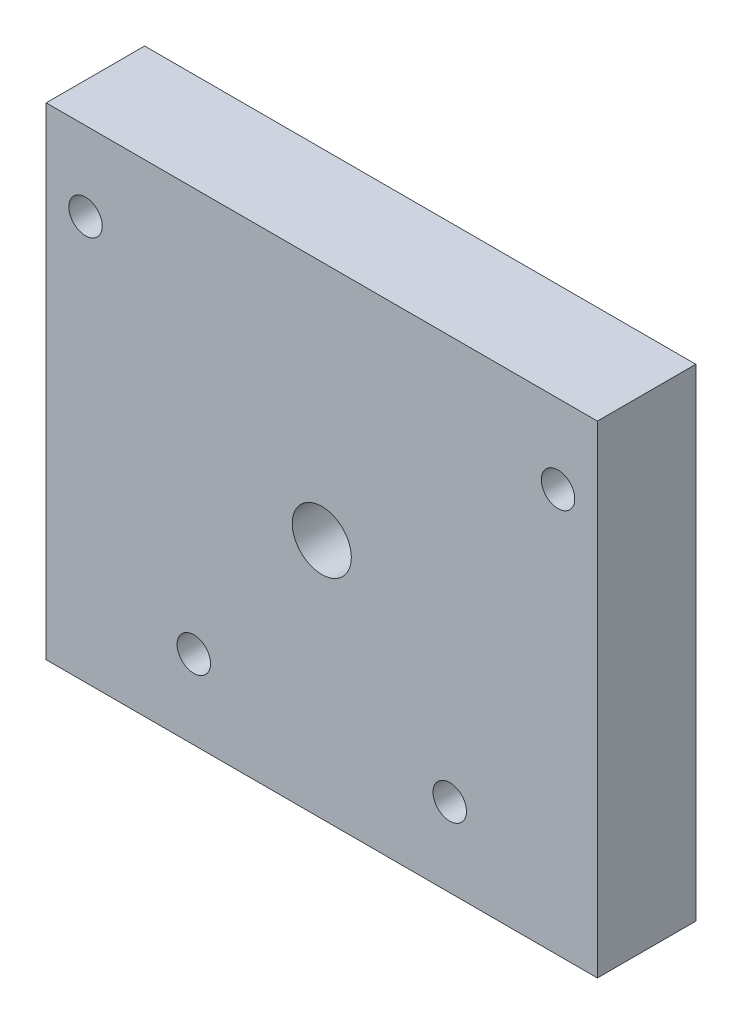
ISO-10303-21;
HEADER;
FILE_DESCRIPTION(('STEP AP214'),'2;1');
FILE_NAME('part.step','',(''),(''),'','','');
FILE_SCHEMA(('AUTOMOTIVE_DESIGN { 1 0 10303 214 1 1 1 1 }'));
ENDSEC;
DATA;
#1=APPLICATION_CONTEXT('core data for automotive mechanical design processes');
#2=APPLICATION_PROTOCOL_DEFINITION('international standard','automotive_design',2000,#1);
#3=PRODUCT_CONTEXT('',#1,'mechanical');
#4=PRODUCT('Part','Part','',(#3));
#5=PRODUCT_RELATED_PRODUCT_CATEGORY('part','',(#4));
#6=PRODUCT_DEFINITION_FORMATION('','',#4);
#7=PRODUCT_DEFINITION_CONTEXT('part definition',#1,'design');
#8=PRODUCT_DEFINITION('design','',#6,#7);
#9=PRODUCT_DEFINITION_SHAPE('','',#8);
#10=(LENGTH_UNIT() NAMED_UNIT(*) SI_UNIT(.MILLI.,.METRE.));
#11=(NAMED_UNIT(*) PLANE_ANGLE_UNIT() SI_UNIT($,.RADIAN.));
#12=(NAMED_UNIT(*) SI_UNIT($,.STERADIAN.) SOLID_ANGLE_UNIT());
#13=UNCERTAINTY_MEASURE_WITH_UNIT(LENGTH_MEASURE(1.E-05),#10,'distance_accuracy_value','');
#14=(GEOMETRIC_REPRESENTATION_CONTEXT(3) GLOBAL_UNCERTAINTY_ASSIGNED_CONTEXT((#13)) GLOBAL_UNIT_ASSIGNED_CONTEXT((#10,
#11,#12)) REPRESENTATION_CONTEXT('',''));
#15=CARTESIAN_POINT('',(0.,0.,0.));
#16=DIRECTION('',(0.,0.,1.));
#17=DIRECTION('',(1.,0.,0.));
#18=AXIS2_PLACEMENT_3D('',#15,#16,#17);
#19=CARTESIAN_POINT('',(-120.,82.5,50.));
#20=DIRECTION('',(0.,0.,-1.));
#21=DIRECTION('',(-1.,0.,0.));
#22=AXIS2_PLACEMENT_3D('',#19,#20,#21);
#23=CYLINDRICAL_SURFACE('',#22,5.24999999999999);
#24=CARTESIAN_POINT('',(-120.,82.5,0.));
#25=DIRECTION('',(0.,0.,1.));
#26=DIRECTION('',(1.,0.,0.));
#27=AXIS2_PLACEMENT_3D('',#24,#25,#26);
#28=CIRCLE('',#27,5.24999999999999);
#29=CARTESIAN_POINT('',(-114.75,82.5,0.));
#30=VERTEX_POINT('',#29);
#31=EDGE_CURVE('E138',#30,#30,#28,.T.);
#32=ORIENTED_EDGE('',*,*,#31,.F.);
#33=EDGE_LOOP('',(#32));
#34=FACE_BOUND('',#33,.T.);
#35=CARTESIAN_POINT('',(-120.,82.5,38.));
#36=DIRECTION('',(0.,0.,1.));
#37=DIRECTION('',(1.,0.,0.));
#38=AXIS2_PLACEMENT_3D('',#35,#36,#37);
#39=CIRCLE('',#38,5.24999999999999);
#40=CARTESIAN_POINT('',(-114.75,82.5,38.));
#41=VERTEX_POINT('',#40);
#42=EDGE_CURVE('E37',#41,#41,#39,.T.);
#43=ORIENTED_EDGE('',*,*,#42,.T.);
#44=EDGE_LOOP('',(#43));
#45=FACE_BOUND('',#44,.T.);
#46=ADVANCED_FACE('F33',(#34,#45),#23,.F.);
#47=CARTESIAN_POINT('',(120.,82.5,50.));
#48=DIRECTION('',(0.,0.,-1.));
#49=DIRECTION('',(-1.,0.,0.));
#50=AXIS2_PLACEMENT_3D('',#47,#48,#49);
#51=CYLINDRICAL_SURFACE('',#50,5.24999999999999);
#52=CARTESIAN_POINT('',(120.,82.5,0.));
#53=DIRECTION('',(0.,0.,1.));
#54=DIRECTION('',(1.,0.,0.));
#55=AXIS2_PLACEMENT_3D('',#52,#53,#54);
#56=CIRCLE('',#55,5.24999999999999);
#57=CARTESIAN_POINT('',(125.25,82.5,0.));
#58=VERTEX_POINT('',#57);
#59=EDGE_CURVE('E130',#58,#58,#56,.T.);
#60=ORIENTED_EDGE('',*,*,#59,.F.);
#61=EDGE_LOOP('',(#60));
#62=FACE_BOUND('',#61,.T.);
#63=CARTESIAN_POINT('',(120.,82.5,38.));
#64=DIRECTION('',(0.,0.,1.));
#65=DIRECTION('',(1.,0.,0.));
#66=AXIS2_PLACEMENT_3D('',#63,#64,#65);
#67=CIRCLE('',#66,5.24999999999999);
#68=CARTESIAN_POINT('',(125.25,82.5,38.));
#69=VERTEX_POINT('',#68);
#70=EDGE_CURVE('E116',#69,#69,#67,.T.);
#71=ORIENTED_EDGE('',*,*,#70,.T.);
#72=EDGE_LOOP('',(#71));
#73=FACE_BOUND('',#72,.T.);
#74=ADVANCED_FACE('F167',(#62,#73),#51,.F.);
#75=CARTESIAN_POINT('',(-65.,-82.5,50.));
#76=DIRECTION('',(0.,0.,-1.));
#77=DIRECTION('',(-1.,0.,0.));
#78=AXIS2_PLACEMENT_3D('',#75,#76,#77);
#79=CYLINDRICAL_SURFACE('',#78,5.25);
#80=CARTESIAN_POINT('',(-65.,-82.5,0.));
#81=DIRECTION('',(0.,0.,1.));
#82=DIRECTION('',(1.,0.,0.));
#83=AXIS2_PLACEMENT_3D('',#80,#81,#82);
#84=CIRCLE('',#83,5.25);
#85=CARTESIAN_POINT('',(-59.75,-82.5,0.));
#86=VERTEX_POINT('',#85);
#87=EDGE_CURVE('E125',#86,#86,#84,.T.);
#88=ORIENTED_EDGE('',*,*,#87,.F.);
#89=EDGE_LOOP('',(#88));
#90=FACE_BOUND('',#89,.T.);
#91=CARTESIAN_POINT('',(-65.,-82.5,38.));
#92=DIRECTION('',(0.,0.,1.));
#93=DIRECTION('',(1.,0.,0.));
#94=AXIS2_PLACEMENT_3D('',#91,#92,#93);
#95=CIRCLE('',#94,5.25);
#96=CARTESIAN_POINT('',(-59.75,-82.5,38.));
#97=VERTEX_POINT('',#96);
#98=EDGE_CURVE('E113',#97,#97,#95,.T.);
#99=ORIENTED_EDGE('',*,*,#98,.T.);
#100=EDGE_LOOP('',(#99));
#101=FACE_BOUND('',#100,.T.);
#102=ADVANCED_FACE('F172',(#90,#101),#79,.F.);
#103=CARTESIAN_POINT('',(65.,-82.5,50.));
#104=DIRECTION('',(0.,0.,-1.));
#105=DIRECTION('',(-1.,0.,0.));
#106=AXIS2_PLACEMENT_3D('',#103,#104,#105);
#107=CYLINDRICAL_SURFACE('',#106,5.25);
#108=CARTESIAN_POINT('',(65.,-82.5,0.));
#109=DIRECTION('',(0.,0.,1.));
#110=DIRECTION('',(1.,0.,0.));
#111=AXIS2_PLACEMENT_3D('',#108,#109,#110);
#112=CIRCLE('',#111,5.25);
#113=CARTESIAN_POINT('',(70.25,-82.5,0.));
#114=VERTEX_POINT('',#113);
#115=EDGE_CURVE('E121',#114,#114,#112,.T.);
#116=ORIENTED_EDGE('',*,*,#115,.F.);
#117=EDGE_LOOP('',(#116));
#118=FACE_BOUND('',#117,.T.);
#119=CARTESIAN_POINT('',(65.,-82.5,38.));
#120=DIRECTION('',(0.,0.,1.));
#121=DIRECTION('',(1.,0.,0.));
#122=AXIS2_PLACEMENT_3D('',#119,#120,#121);
#123=CIRCLE('',#122,5.25);
#124=CARTESIAN_POINT('',(70.25,-82.5,38.));
#125=VERTEX_POINT('',#124);
#126=EDGE_CURVE('E110',#125,#125,#123,.T.);
#127=ORIENTED_EDGE('',*,*,#126,.T.);
#128=EDGE_LOOP('',(#127));
#129=FACE_BOUND('',#128,.T.);
#130=ADVANCED_FACE('F179',(#118,#129),#107,.F.);
#131=CARTESIAN_POINT('',(0.,0.,50.));
#132=DIRECTION('',(0.,0.,-1.));
#133=DIRECTION('',(-1.,0.,0.));
#134=AXIS2_PLACEMENT_3D('',#131,#132,#133);
#135=PLANE('',#134);
#136=CARTESIAN_POINT('',(-120.,82.5,50.));
#137=DIRECTION('',(0.,0.,1.));
#138=DIRECTION('',(1.,0.,0.));
#139=AXIS2_PLACEMENT_3D('',#136,#137,#138);
#140=CIRCLE('',#139,8.49999999999999);
#141=CARTESIAN_POINT('',(-111.5,82.5,50.));
#142=VERTEX_POINT('',#141);
#143=EDGE_CURVE('E215',#142,#142,#140,.T.);
#144=ORIENTED_EDGE('',*,*,#143,.F.);
#145=EDGE_LOOP('',(#144));
#146=FACE_BOUND('',#145,.T.);
#147=CARTESIAN_POINT('',(120.,82.5,50.));
#148=DIRECTION('',(0.,0.,1.));
#149=DIRECTION('',(1.,0.,0.));
#150=AXIS2_PLACEMENT_3D('',#147,#148,#149);
#151=CIRCLE('',#150,8.49999999999999);
#152=CARTESIAN_POINT('',(128.5,82.5,50.));
#153=VERTEX_POINT('',#152);
#154=EDGE_CURVE('E223',#153,#153,#151,.T.);
#155=ORIENTED_EDGE('',*,*,#154,.F.);
#156=EDGE_LOOP('',(#155));
#157=FACE_BOUND('',#156,.T.);
#158=CARTESIAN_POINT('',(65.,-82.5,50.));
#159=DIRECTION('',(0.,0.,1.));
#160=DIRECTION('',(1.,0.,0.));
#161=AXIS2_PLACEMENT_3D('',#158,#159,#160);
#162=CIRCLE('',#161,8.5);
#163=CARTESIAN_POINT('',(73.5,-82.5,50.));
#164=VERTEX_POINT('',#163);
#165=EDGE_CURVE('E229',#164,#164,#162,.T.);
#166=ORIENTED_EDGE('',*,*,#165,.F.);
#167=EDGE_LOOP('',(#166));
#168=FACE_BOUND('',#167,.T.);
#169=CARTESIAN_POINT('',(-65.,-82.5,50.));
#170=DIRECTION('',(0.,0.,1.));
#171=DIRECTION('',(1.,0.,0.));
#172=AXIS2_PLACEMENT_3D('',#169,#170,#171);
#173=CIRCLE('',#172,8.5);
#174=CARTESIAN_POINT('',(-56.5,-82.5,50.));
#175=VERTEX_POINT('',#174);
#176=EDGE_CURVE('E133',#175,#175,#173,.T.);
#177=ORIENTED_EDGE('',*,*,#176,.F.);
#178=EDGE_LOOP('',(#177));
#179=FACE_BOUND('',#178,.T.);
#180=DIRECTION('',(0.,1.,0.));
#181=VECTOR('',#180,1.);
#182=CARTESIAN_POINT('',(140.,-122.5,50.));
#183=LINE('',#182,#181);
#184=CARTESIAN_POINT('',(140.,-122.5,50.));
#185=VERTEX_POINT('',#184);
#186=CARTESIAN_POINT('',(140.,122.5,50.));
#187=VERTEX_POINT('',#186);
#188=EDGE_CURVE('E88',#185,#187,#183,.T.);
#189=ORIENTED_EDGE('',*,*,#188,.T.);
#190=DIRECTION('',(-1.,0.,0.));
#191=VECTOR('',#190,1.);
#192=CARTESIAN_POINT('',(-140.,122.5,50.));
#193=LINE('',#192,#191);
#194=CARTESIAN_POINT('',(-140.,122.5,50.));
#195=VERTEX_POINT('',#194);
#196=EDGE_CURVE('E82',#187,#195,#193,.T.);
#197=ORIENTED_EDGE('',*,*,#196,.T.);
#198=DIRECTION('',(0.,-1.,0.));
#199=VECTOR('',#198,1.);
#200=CARTESIAN_POINT('',(-140.,-122.5,50.));
#201=LINE('',#200,#199);
#202=CARTESIAN_POINT('',(-140.,-122.5,50.));
#203=VERTEX_POINT('',#202);
#204=EDGE_CURVE('E86',#195,#203,#201,.T.);
#205=ORIENTED_EDGE('',*,*,#204,.T.);
#206=DIRECTION('',(1.,0.,0.));
#207=VECTOR('',#206,1.);
#208=CARTESIAN_POINT('',(-140.,-122.5,50.));
#209=LINE('',#208,#207);
#210=EDGE_CURVE('E52',#203,#185,#209,.T.);
#211=ORIENTED_EDGE('',*,*,#210,.T.);
#212=EDGE_LOOP('',(#189,#197,#205,#211));
#213=FACE_BOUND('',#212,.T.);
#214=CARTESIAN_POINT('',(0.,0.,50.));
#215=DIRECTION('',(0.,0.,1.));
#216=DIRECTION('',(1.,0.,0.));
#217=AXIS2_PLACEMENT_3D('',#214,#215,#216);
#218=CIRCLE('',#217,15.);
#219=CARTESIAN_POINT('',(15.,0.,50.));
#220=VERTEX_POINT('',#219);
#221=EDGE_CURVE('E104',#220,#220,#218,.T.);
#222=ORIENTED_EDGE('',*,*,#221,.F.);
#223=EDGE_LOOP('',(#222));
#224=FACE_BOUND('',#223,.T.);
#225=ADVANCED_FACE('F83',(#146,#157,#168,#179,#213,#224),#135,.F.);
#226=CARTESIAN_POINT('',(0.,0.,0.));
#227=DIRECTION('',(0.,0.,-1.));
#228=DIRECTION('',(-1.,0.,0.));
#229=AXIS2_PLACEMENT_3D('',#226,#227,#228);
#230=PLANE('',#229);
#231=ORIENTED_EDGE('',*,*,#87,.T.);
#232=EDGE_LOOP('',(#231));
#233=FACE_BOUND('',#232,.T.);
#234=ORIENTED_EDGE('',*,*,#31,.T.);
#235=EDGE_LOOP('',(#234));
#236=FACE_BOUND('',#235,.T.);
#237=DIRECTION('',(0.,1.,0.));
#238=VECTOR('',#237,1.);
#239=CARTESIAN_POINT('',(140.,-122.5,0.));
#240=LINE('',#239,#238);
#241=CARTESIAN_POINT('',(140.,-122.5,0.));
#242=VERTEX_POINT('',#241);
#243=CARTESIAN_POINT('',(140.,122.5,0.));
#244=VERTEX_POINT('',#243);
#245=EDGE_CURVE('E101',#242,#244,#240,.T.);
#246=ORIENTED_EDGE('',*,*,#245,.F.);
#247=DIRECTION('',(1.,0.,0.));
#248=VECTOR('',#247,1.);
#249=CARTESIAN_POINT('',(-140.,-122.5,0.));
#250=LINE('',#249,#248);
#251=CARTESIAN_POINT('',(-140.,-122.5,0.));
#252=VERTEX_POINT('',#251);
#253=EDGE_CURVE('E75',#252,#242,#250,.T.);
#254=ORIENTED_EDGE('',*,*,#253,.F.);
#255=DIRECTION('',(0.,-1.,0.));
#256=VECTOR('',#255,1.);
#257=CARTESIAN_POINT('',(-140.,-122.5,0.));
#258=LINE('',#257,#256);
#259=CARTESIAN_POINT('',(-140.,122.5,0.));
#260=VERTEX_POINT('',#259);
#261=EDGE_CURVE('E69',#260,#252,#258,.T.);
#262=ORIENTED_EDGE('',*,*,#261,.F.);
#263=DIRECTION('',(-1.,0.,0.));
#264=VECTOR('',#263,1.);
#265=CARTESIAN_POINT('',(-140.,122.5,0.));
#266=LINE('',#265,#264);
#267=EDGE_CURVE('E92',#244,#260,#266,.T.);
#268=ORIENTED_EDGE('',*,*,#267,.F.);
#269=EDGE_LOOP('',(#246,#254,#262,#268));
#270=FACE_BOUND('',#269,.T.);
#271=CARTESIAN_POINT('',(0.,0.,0.));
#272=DIRECTION('',(0.,0.,1.));
#273=DIRECTION('',(1.,0.,0.));
#274=AXIS2_PLACEMENT_3D('',#271,#272,#273);
#275=CIRCLE('',#274,15.);
#276=CARTESIAN_POINT('',(15.,0.,0.));
#277=VERTEX_POINT('',#276);
#278=EDGE_CURVE('E141',#277,#277,#275,.T.);
#279=ORIENTED_EDGE('',*,*,#278,.T.);
#280=EDGE_LOOP('',(#279));
#281=FACE_BOUND('',#280,.T.);
#282=ORIENTED_EDGE('',*,*,#59,.T.);
#283=EDGE_LOOP('',(#282));
#284=FACE_BOUND('',#283,.T.);
#285=ORIENTED_EDGE('',*,*,#115,.T.);
#286=EDGE_LOOP('',(#285));
#287=FACE_BOUND('',#286,.T.);
#288=ADVANCED_FACE('F147',(#233,#236,#270,#281,#284,#287),#230,.T.);
#289=CARTESIAN_POINT('',(140.,-122.5,50.));
#290=DIRECTION('',(-1.,0.,0.));
#291=DIRECTION('',(0.,0.,1.));
#292=AXIS2_PLACEMENT_3D('',#289,#290,#291);
#293=PLANE('',#292);
#294=ORIENTED_EDGE('',*,*,#245,.T.);
#295=DIRECTION('',(0.,0.,-1.));
#296=VECTOR('',#295,1.);
#297=CARTESIAN_POINT('',(140.,122.5,50.));
#298=LINE('',#297,#296);
#299=EDGE_CURVE('E11',#187,#244,#298,.T.);
#300=ORIENTED_EDGE('',*,*,#299,.F.);
#301=ORIENTED_EDGE('',*,*,#188,.F.);
#302=DIRECTION('',(0.,0.,-1.));
#303=VECTOR('',#302,1.);
#304=CARTESIAN_POINT('',(140.,-122.5,50.));
#305=LINE('',#304,#303);
#306=EDGE_CURVE('E97',#185,#242,#305,.T.);
#307=ORIENTED_EDGE('',*,*,#306,.T.);
#308=EDGE_LOOP('',(#294,#300,#301,#307));
#309=FACE_BOUND('',#308,.T.);
#310=ADVANCED_FACE('F35',(#309),#293,.F.);
#311=CARTESIAN_POINT('',(-140.,122.5,50.));
#312=DIRECTION('',(0.,-1.,0.));
#313=DIRECTION('',(0.,0.,-1.));
#314=AXIS2_PLACEMENT_3D('',#311,#312,#313);
#315=PLANE('',#314);
#316=ORIENTED_EDGE('',*,*,#267,.T.);
#317=DIRECTION('',(0.,0.,-1.));
#318=VECTOR('',#317,1.);
#319=CARTESIAN_POINT('',(-140.,122.5,50.));
#320=LINE('',#319,#318);
#321=EDGE_CURVE('E43',#195,#260,#320,.T.);
#322=ORIENTED_EDGE('',*,*,#321,.F.);
#323=ORIENTED_EDGE('',*,*,#196,.F.);
#324=ORIENTED_EDGE('',*,*,#299,.T.);
#325=EDGE_LOOP('',(#316,#322,#323,#324));
#326=FACE_BOUND('',#325,.T.);
#327=ADVANCED_FACE('F91',(#326),#315,.F.);
#328=CARTESIAN_POINT('',(-140.,-122.5,50.));
#329=DIRECTION('',(1.,0.,0.));
#330=DIRECTION('',(0.,0.,-1.));
#331=AXIS2_PLACEMENT_3D('',#328,#329,#330);
#332=PLANE('',#331);
#333=ORIENTED_EDGE('',*,*,#261,.T.);
#334=DIRECTION('',(0.,0.,-1.));
#335=VECTOR('',#334,1.);
#336=CARTESIAN_POINT('',(-140.,-122.5,50.));
#337=LINE('',#336,#335);
#338=EDGE_CURVE('E93',#203,#252,#337,.T.);
#339=ORIENTED_EDGE('',*,*,#338,.F.);
#340=ORIENTED_EDGE('',*,*,#204,.F.);
#341=ORIENTED_EDGE('',*,*,#321,.T.);
#342=EDGE_LOOP('',(#333,#339,#340,#341));
#343=FACE_BOUND('',#342,.T.);
#344=ADVANCED_FACE('F95',(#343),#332,.F.);
#345=CARTESIAN_POINT('',(-140.,-122.5,50.));
#346=DIRECTION('',(0.,1.,0.));
#347=DIRECTION('',(0.,0.,1.));
#348=AXIS2_PLACEMENT_3D('',#345,#346,#347);
#349=PLANE('',#348);
#350=ORIENTED_EDGE('',*,*,#253,.T.);
#351=ORIENTED_EDGE('',*,*,#306,.F.);
#352=ORIENTED_EDGE('',*,*,#210,.F.);
#353=ORIENTED_EDGE('',*,*,#338,.T.);
#354=EDGE_LOOP('',(#350,#351,#352,#353));
#355=FACE_BOUND('',#354,.T.);
#356=ADVANCED_FACE('F153',(#355),#349,.F.);
#357=CARTESIAN_POINT('',(0.,0.,50.));
#358=DIRECTION('',(0.,0.,-1.));
#359=DIRECTION('',(-1.,0.,0.));
#360=AXIS2_PLACEMENT_3D('',#357,#358,#359);
#361=CYLINDRICAL_SURFACE('',#360,15.);
#362=ORIENTED_EDGE('',*,*,#221,.T.);
#363=EDGE_LOOP('',(#362));
#364=FACE_BOUND('',#363,.T.);
#365=ORIENTED_EDGE('',*,*,#278,.F.);
#366=EDGE_LOOP('',(#365));
#367=FACE_BOUND('',#366,.T.);
#368=ADVANCED_FACE('F150',(#364,#367),#361,.F.);
#369=CARTESIAN_POINT('',(65.,-82.5,38.));
#370=DIRECTION('',(0.,0.,1.));
#371=DIRECTION('',(1.,0.,0.));
#372=AXIS2_PLACEMENT_3D('',#369,#370,#371);
#373=CYLINDRICAL_SURFACE('',#372,8.5);
#374=CARTESIAN_POINT('',(65.,-82.5,38.));
#375=DIRECTION('',(0.,0.,1.));
#376=DIRECTION('',(1.,0.,0.));
#377=AXIS2_PLACEMENT_3D('',#374,#375,#376);
#378=CIRCLE('',#377,8.5);
#379=CARTESIAN_POINT('',(73.5,-82.5,38.));
#380=VERTEX_POINT('',#379);
#381=EDGE_CURVE('E226',#380,#380,#378,.T.);
#382=ORIENTED_EDGE('',*,*,#381,.F.);
#383=EDGE_LOOP('',(#382));
#384=FACE_BOUND('',#383,.T.);
#385=ORIENTED_EDGE('',*,*,#165,.T.);
#386=EDGE_LOOP('',(#385));
#387=FACE_BOUND('',#386,.T.);
#388=ADVANCED_FACE('F152',(#384,#387),#373,.F.);
#389=CARTESIAN_POINT('',(65.,-82.5,38.));
#390=DIRECTION('',(0.,0.,1.));
#391=DIRECTION('',(1.,0.,0.));
#392=AXIS2_PLACEMENT_3D('',#389,#390,#391);
#393=PLANE('',#392);
#394=ORIENTED_EDGE('',*,*,#126,.F.);
#395=EDGE_LOOP('',(#394));
#396=FACE_BOUND('',#395,.T.);
#397=ORIENTED_EDGE('',*,*,#381,.T.);
#398=EDGE_LOOP('',(#397));
#399=FACE_BOUND('',#398,.T.);
#400=ADVANCED_FACE('F160',(#396,#399),#393,.T.);
#401=CARTESIAN_POINT('',(-65.,-82.5,38.));
#402=DIRECTION('',(0.,0.,1.));
#403=DIRECTION('',(1.,0.,0.));
#404=AXIS2_PLACEMENT_3D('',#401,#402,#403);
#405=CYLINDRICAL_SURFACE('',#404,8.5);
#406=CARTESIAN_POINT('',(-65.,-82.5,38.));
#407=DIRECTION('',(0.,0.,1.));
#408=DIRECTION('',(1.,0.,0.));
#409=AXIS2_PLACEMENT_3D('',#406,#407,#408);
#410=CIRCLE('',#409,8.5);
#411=CARTESIAN_POINT('',(-56.5,-82.5,38.));
#412=VERTEX_POINT('',#411);
#413=EDGE_CURVE('E231',#412,#412,#410,.T.);
#414=ORIENTED_EDGE('',*,*,#413,.F.);
#415=EDGE_LOOP('',(#414));
#416=FACE_BOUND('',#415,.T.);
#417=ORIENTED_EDGE('',*,*,#176,.T.);
#418=EDGE_LOOP('',(#417));
#419=FACE_BOUND('',#418,.T.);
#420=ADVANCED_FACE('F184',(#416,#419),#405,.F.);
#421=CARTESIAN_POINT('',(-65.,-82.5,38.));
#422=DIRECTION('',(0.,0.,1.));
#423=DIRECTION('',(1.,0.,0.));
#424=AXIS2_PLACEMENT_3D('',#421,#422,#423);
#425=PLANE('',#424);
#426=ORIENTED_EDGE('',*,*,#98,.F.);
#427=EDGE_LOOP('',(#426));
#428=FACE_BOUND('',#427,.T.);
#429=ORIENTED_EDGE('',*,*,#413,.T.);
#430=EDGE_LOOP('',(#429));
#431=FACE_BOUND('',#430,.T.);
#432=ADVANCED_FACE('F187',(#428,#431),#425,.T.);
#433=CARTESIAN_POINT('',(120.,82.5,38.));
#434=DIRECTION('',(0.,0.,1.));
#435=DIRECTION('',(1.,0.,0.));
#436=AXIS2_PLACEMENT_3D('',#433,#434,#435);
#437=CYLINDRICAL_SURFACE('',#436,8.49999999999999);
#438=CARTESIAN_POINT('',(120.,82.5,38.));
#439=DIRECTION('',(0.,0.,1.));
#440=DIRECTION('',(1.,0.,0.));
#441=AXIS2_PLACEMENT_3D('',#438,#439,#440);
#442=CIRCLE('',#441,8.49999999999999);
#443=CARTESIAN_POINT('',(128.5,82.5,38.));
#444=VERTEX_POINT('',#443);
#445=EDGE_CURVE('E218',#444,#444,#442,.T.);
#446=ORIENTED_EDGE('',*,*,#445,.F.);
#447=EDGE_LOOP('',(#446));
#448=FACE_BOUND('',#447,.T.);
#449=ORIENTED_EDGE('',*,*,#154,.T.);
#450=EDGE_LOOP('',(#449));
#451=FACE_BOUND('',#450,.T.);
#452=ADVANCED_FACE('F190',(#448,#451),#437,.F.);
#453=CARTESIAN_POINT('',(120.,82.5,38.));
#454=DIRECTION('',(0.,0.,1.));
#455=DIRECTION('',(1.,0.,0.));
#456=AXIS2_PLACEMENT_3D('',#453,#454,#455);
#457=PLANE('',#456);
#458=ORIENTED_EDGE('',*,*,#70,.F.);
#459=EDGE_LOOP('',(#458));
#460=FACE_BOUND('',#459,.T.);
#461=ORIENTED_EDGE('',*,*,#445,.T.);
#462=EDGE_LOOP('',(#461));
#463=FACE_BOUND('',#462,.T.);
#464=ADVANCED_FACE('F198',(#460,#463),#457,.T.);
#465=CARTESIAN_POINT('',(-120.,82.5,38.));
#466=DIRECTION('',(0.,0.,1.));
#467=DIRECTION('',(1.,0.,0.));
#468=AXIS2_PLACEMENT_3D('',#465,#466,#467);
#469=CYLINDRICAL_SURFACE('',#468,8.49999999999999);
#470=CARTESIAN_POINT('',(-120.,82.5,38.));
#471=DIRECTION('',(0.,0.,1.));
#472=DIRECTION('',(1.,0.,0.));
#473=AXIS2_PLACEMENT_3D('',#470,#471,#472);
#474=CIRCLE('',#473,8.49999999999999);
#475=CARTESIAN_POINT('',(-111.5,82.5,38.));
#476=VERTEX_POINT('',#475);
#477=EDGE_CURVE('E114',#476,#476,#474,.T.);
#478=ORIENTED_EDGE('',*,*,#477,.F.);
#479=EDGE_LOOP('',(#478));
#480=FACE_BOUND('',#479,.T.);
#481=ORIENTED_EDGE('',*,*,#143,.T.);
#482=EDGE_LOOP('',(#481));
#483=FACE_BOUND('',#482,.T.);
#484=ADVANCED_FACE('F202',(#480,#483),#469,.F.);
#485=CARTESIAN_POINT('',(-120.,82.5,38.));
#486=DIRECTION('',(0.,0.,1.));
#487=DIRECTION('',(1.,0.,0.));
#488=AXIS2_PLACEMENT_3D('',#485,#486,#487);
#489=PLANE('',#488);
#490=ORIENTED_EDGE('',*,*,#42,.F.);
#491=EDGE_LOOP('',(#490));
#492=FACE_BOUND('',#491,.T.);
#493=ORIENTED_EDGE('',*,*,#477,.T.);
#494=EDGE_LOOP('',(#493));
#495=FACE_BOUND('',#494,.T.);
#496=ADVANCED_FACE('F206',(#492,#495),#489,.T.);
#497=CLOSED_SHELL('',(#46,#74,#102,#130,#225,#288,#310,#327,#344,#356,#368,#388,#400,#420,#432,
#452,#464,#484,#496));
#498=MANIFOLD_SOLID_BREP('B2',#497);
#499=ADVANCED_BREP_SHAPE_REPRESENTATION('',(#18,#498),#14);
#500=SHAPE_DEFINITION_REPRESENTATION(#9,#499);
ENDSEC;
END-ISO-10303-21;
